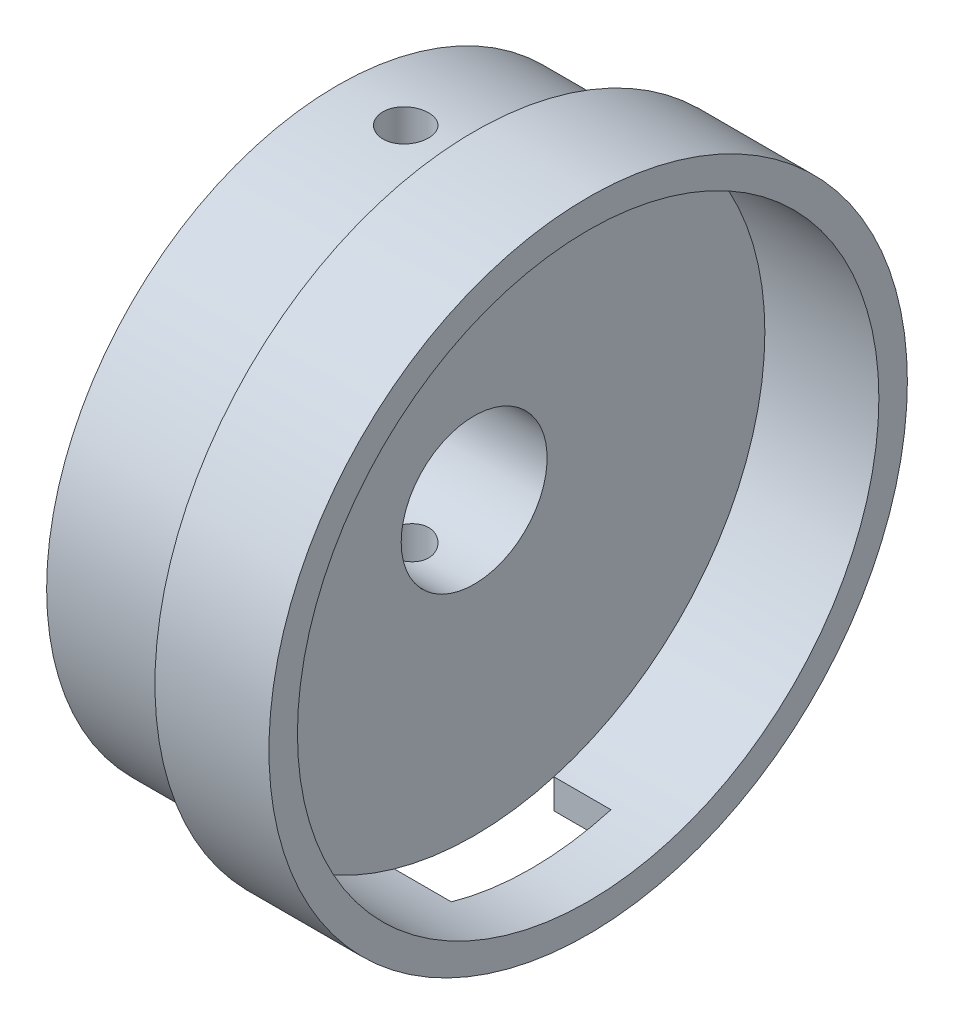
ISO-10303-21;
HEADER;
FILE_DESCRIPTION(('STEP AP214'),'2;1');
FILE_NAME('part.step','',(''),(''),'','','');
FILE_SCHEMA(('AUTOMOTIVE_DESIGN { 1 0 10303 214 1 1 1 1 }'));
ENDSEC;
DATA;
#1=APPLICATION_CONTEXT('core data for automotive mechanical design processes');
#2=APPLICATION_PROTOCOL_DEFINITION('international standard','automotive_design',2000,#1);
#3=PRODUCT_CONTEXT('',#1,'mechanical');
#4=PRODUCT('Part','Part','',(#3));
#5=PRODUCT_RELATED_PRODUCT_CATEGORY('part','',(#4));
#6=PRODUCT_DEFINITION_FORMATION('','',#4);
#7=PRODUCT_DEFINITION_CONTEXT('part definition',#1,'design');
#8=PRODUCT_DEFINITION('design','',#6,#7);
#9=PRODUCT_DEFINITION_SHAPE('','',#8);
#10=(LENGTH_UNIT() NAMED_UNIT(*) SI_UNIT(.MILLI.,.METRE.));
#11=(NAMED_UNIT(*) PLANE_ANGLE_UNIT() SI_UNIT($,.RADIAN.));
#12=(NAMED_UNIT(*) SI_UNIT($,.STERADIAN.) SOLID_ANGLE_UNIT());
#13=UNCERTAINTY_MEASURE_WITH_UNIT(LENGTH_MEASURE(1.E-05),#10,'distance_accuracy_value','');
#14=(GEOMETRIC_REPRESENTATION_CONTEXT(3) GLOBAL_UNCERTAINTY_ASSIGNED_CONTEXT((#13)) GLOBAL_UNIT_ASSIGNED_CONTEXT((#10,
#11,#12)) REPRESENTATION_CONTEXT('',''));
#15=CARTESIAN_POINT('',(0.,0.,0.));
#16=DIRECTION('',(0.,0.,1.));
#17=DIRECTION('',(1.,0.,0.));
#18=AXIS2_PLACEMENT_3D('',#15,#16,#17);
#19=CARTESIAN_POINT('',(6.,0.,0.));
#20=DIRECTION('',(-1.,0.,0.));
#21=DIRECTION('',(0.,0.,1.));
#22=AXIS2_PLACEMENT_3D('',#19,#20,#21);
#23=CYLINDRICAL_SURFACE('',#22,12.75);
#24=CARTESIAN_POINT('',(3.,-12.7107238188862,1.));
#25=CARTESIAN_POINT('',(2.94392232232207,-12.7107243406113,0.999997545402997));
#26=CARTESIAN_POINT('',(2.88780618341134,-12.711098921578,0.995267076426431));
#27=CARTESIAN_POINT('',(2.77712574140391,-12.7125568074061,0.976465511087359));
#28=CARTESIAN_POINT('',(2.72256328335643,-12.7136409210018,0.962383755741015));
#29=CARTESIAN_POINT('',(2.61660929830477,-12.7163943301847,0.925288653760039));
#30=CARTESIAN_POINT('',(2.56521602438958,-12.718063299936,0.902280279573718));
#31=CARTESIAN_POINT('',(2.46703350745583,-12.7217979609019,0.847993707915265));
#32=CARTESIAN_POINT('',(2.42024326497816,-12.7238635657059,0.816717311146294));
#33=CARTESIAN_POINT('',(2.33247534573659,-12.7281640714423,0.746704944077508));
#34=CARTESIAN_POINT('',(2.2915096498998,-12.7303993072281,0.707953973655698));
#35=CARTESIAN_POINT('',(2.21665653635731,-12.7347841425398,0.624124054158458));
#36=CARTESIAN_POINT('',(2.18276942419433,-12.736933738366,0.579044832068279));
#37=CARTESIAN_POINT('',(2.12299615019229,-12.7409082086844,0.483767341341656));
#38=CARTESIAN_POINT('',(2.09712026471766,-12.7427326648433,0.433562606787841));
#39=CARTESIAN_POINT('',(2.05416970584272,-12.7458476952644,0.329504380476724));
#40=CARTESIAN_POINT('',(2.03709489403979,-12.747138277922,0.275650946112666));
#41=CARTESIAN_POINT('',(2.01226541450545,-12.7490378120676,0.165942540916012));
#42=CARTESIAN_POINT('',(2.00449148127114,-12.7496481723632,0.110091955077326));
#43=CARTESIAN_POINT('',(1.99842489139892,-12.7501232582708,-0.00212443471230447));
#44=CARTESIAN_POINT('',(2.00013207654042,-12.7499879963258,-0.0584902300497793));
#45=CARTESIAN_POINT('',(2.01296347370499,-12.7489882436735,-0.170006427252905));
#46=CARTESIAN_POINT('',(2.02406696745649,-12.7481253573473,-0.225159229408966));
#47=CARTESIAN_POINT('',(2.05534359572843,-12.745769280099,-0.332815873257527));
#48=CARTESIAN_POINT('',(2.07551680814398,-12.7442760837637,-0.38531969219497));
#49=CARTESIAN_POINT('',(2.12438341808861,-12.7408246459017,-0.486254061625724));
#50=CARTESIAN_POINT('',(2.15308612321126,-12.7388658968223,-0.534680087859944));
#51=CARTESIAN_POINT('',(2.21819019397672,-12.7347035593126,-0.626034849173092));
#52=CARTESIAN_POINT('',(2.25459169765977,-12.7324999664926,-0.6689634856611));
#53=CARTESIAN_POINT('',(2.33417689364711,-12.7280886774864,-0.748225963049407));
#54=CARTESIAN_POINT('',(2.37737858350749,-12.7258809862274,-0.784541735826188));
#55=CARTESIAN_POINT('',(2.46927500756309,-12.7217163058945,-0.849408098474019));
#56=CARTESIAN_POINT('',(2.51796974557232,-12.7197593169947,-0.877958682953383));
#57=CARTESIAN_POINT('',(2.6194823749345,-12.7163172052411,-0.926483379180942));
#58=CARTESIAN_POINT('',(2.67230069422166,-12.7148321314427,-0.946456599391364));
#59=CARTESIAN_POINT('',(2.78055532226589,-12.7125028949324,-0.977246460155808));
#60=CARTESIAN_POINT('',(2.83599158232287,-12.7116587203034,-0.988063270970628));
#61=CARTESIAN_POINT('',(2.94775048682875,-12.7107087435387,-1.00021048522529));
#62=CARTESIAN_POINT('',(3.00407037900687,-12.7106009819117,-1.00156606387868));
#63=CARTESIAN_POINT('',(3.11613663909585,-12.7111308578479,-0.994818235999364));
#64=CARTESIAN_POINT('',(3.17188301173298,-12.7117684892634,-0.986714907478841));
#65=CARTESIAN_POINT('',(3.28114780781388,-12.713715516424,-0.961300257086736));
#66=CARTESIAN_POINT('',(3.33466897111362,-12.7150240579116,-0.944000643647751));
#67=CARTESIAN_POINT('',(3.43804887258968,-12.7181647486445,-0.900696386768301));
#68=CARTESIAN_POINT('',(3.48790755860196,-12.7199969053458,-0.874691619371105));
#69=CARTESIAN_POINT('',(3.58266251935815,-12.7239831344881,-0.814651365968914));
#70=CARTESIAN_POINT('',(3.62754812013035,-12.7261378768791,-0.780599079547204));
#71=CARTESIAN_POINT('',(3.71097498573334,-12.7305242002115,-0.705454719974119));
#72=CARTESIAN_POINT('',(3.74951615371418,-12.7327557823252,-0.664362539375877));
#73=CARTESIAN_POINT('',(3.8192458107727,-12.7370501470376,-0.576196170875936));
#74=CARTESIAN_POINT('',(3.85041796002178,-12.7391125480134,-0.529109038877456));
#75=CARTESIAN_POINT('',(3.90441268401924,-12.7428306783261,-0.430354045736059));
#76=CARTESIAN_POINT('',(3.92723533397699,-12.7444864113262,-0.378686225859589));
#77=CARTESIAN_POINT('',(3.9638550514017,-12.7472028785278,-0.272295462417285));
#78=CARTESIAN_POINT('',(3.97766228474964,-12.7482642827077,-0.217576035742713));
#79=CARTESIAN_POINT('',(3.99589246922727,-12.7496752098695,-0.106586937249481));
#80=CARTESIAN_POINT('',(4.00031557569272,-12.750024744635,-0.0503172911072756));
#81=CARTESIAN_POINT('',(3.99965022793239,-12.7499725733032,0.0620137305025271));
#82=CARTESIAN_POINT('',(3.99458726549804,-12.7495728805939,0.11807525966329));
#83=CARTESIAN_POINT('',(3.97514657956729,-12.7480711560722,0.228549291694919));
#84=CARTESIAN_POINT('',(3.96076884229205,-12.7469691232208,0.282961792126344));
#85=CARTESIAN_POINT('',(3.92311304779474,-12.7441864209204,0.388595371636288));
#86=CARTESIAN_POINT('',(3.89983536618896,-12.7425057758916,0.439816585294884));
#87=CARTESIAN_POINT('',(3.84504347578554,-12.7387540472532,0.537627953709343));
#88=CARTESIAN_POINT('',(3.81352941883443,-12.7366829708417,0.584218193820389));
#89=CARTESIAN_POINT('',(3.74306381830334,-12.7323763466028,0.671575386050892));
#90=CARTESIAN_POINT('',(3.70409347763409,-12.7301403920703,0.712327155497726));
#91=CARTESIAN_POINT('',(3.61985406695048,-12.7257594565525,0.786726845913246));
#92=CARTESIAN_POINT('',(3.5745834698097,-12.7236144977888,0.82037303956043));
#93=CARTESIAN_POINT('',(3.47895032374241,-12.7196544245251,0.879646536623913));
#94=CARTESIAN_POINT('',(3.42857922240978,-12.7178398787974,0.905260066346803));
#95=CARTESIAN_POINT('',(3.32427207854467,-12.7147530893878,0.94763359783564));
#96=CARTESIAN_POINT('',(3.27034023622888,-12.7134802195002,0.96440382831488));
#97=CARTESIAN_POINT('',(3.18007254792011,-12.7119498929408,0.984320593323631));
#98=CARTESIAN_POINT('',(3.14431806890482,-12.7114922132497,0.99019261077096));
#99=CARTESIAN_POINT('',(3.07238106793165,-12.7108790081857,0.998033101791468));
#100=CARTESIAN_POINT('',(3.03619854697133,-12.7107234821088,1.00000158446014));
#101=CARTESIAN_POINT('',(3.,-12.7107238188862,1.));
#102=B_SPLINE_CURVE_WITH_KNOTS('',3,(#24,#25,#26,#27,#28,#29,#30,#31,#32,#33,#34,#35,#36,#37,
#38,#39,#40,#41,#42,#43,#44,#45,#46,#47,#48,#49,#50,#51,#52,#53,#54,#55,#56,#57,#58,#59,#60,#61,
#62,#63,#64,#65,#66,#67,#68,#69,#70,#71,#72,#73,#74,#75,#76,#77,#78,#79,#80,#81,#82,#83,#84,#85,
#86,#87,#88,#89,#90,#91,#92,#93,#94,#95,#96,#97,#98,#99,#100,#101),.UNSPECIFIED.,.T.,.F.,(4,2,2,
2,2,2,2,2,2,2,2,2,2,2,2,2,2,2,2,2,2,2,2,2,2,2,2,2,2,2,2,2,2,2,2,2,2,2,4),(0.,0.168100870826905,
0.336393679635962,0.504592877572134,0.672755473327883,0.841259119796969,1.00977003812079,
1.17849622594289,1.34721976035509,1.51559319851048,1.68396382686409,1.85196417293701,
2.01996596190571,2.18815175602457,2.35634056598756,2.52498223473981,2.69362402058657,
2.86228333094888,3.03093950507095,3.1991467334922,3.36735257463708,3.53534477228793,
3.70333936215948,3.87168781354754,4.04003883459429,4.20875972198815,4.37747908956576,
4.54600787729903,4.71453387534787,4.88260764507332,5.05068166342162,5.21874858909935,
5.38681241649895,5.55530564779693,5.72383979172791,5.8926613625276,6.06128723302562,
6.16979781511516,6.27830814436769),.UNSPECIFIED.);
#103=CARTESIAN_POINT('',(3.,-12.7107238188862,1.));
#104=VERTEX_POINT('',#103);
#105=EDGE_CURVE('E55',#104,#104,#102,.T.);
#106=ORIENTED_EDGE('',*,*,#105,.F.);
#107=EDGE_LOOP('',(#106));
#108=FACE_BOUND('',#107,.T.);
#109=CARTESIAN_POINT('',(6.,0.,0.));
#110=DIRECTION('',(1.,0.,0.));
#111=DIRECTION('',(0.,0.,-1.));
#112=AXIS2_PLACEMENT_3D('',#109,#110,#111);
#113=CIRCLE('',#112,12.75);
#114=CARTESIAN_POINT('',(6.,0.,-12.75));
#115=VERTEX_POINT('',#114);
#116=EDGE_CURVE('E47',#115,#115,#113,.T.);
#117=ORIENTED_EDGE('',*,*,#116,.F.);
#118=EDGE_LOOP('',(#117));
#119=FACE_BOUND('',#118,.T.);
#120=CARTESIAN_POINT('',(0.,0.,0.));
#121=DIRECTION('',(1.,0.,0.));
#122=DIRECTION('',(0.,0.,-1.));
#123=AXIS2_PLACEMENT_3D('',#120,#121,#122);
#124=CIRCLE('',#123,12.75);
#125=CARTESIAN_POINT('',(0.,0.,-12.75));
#126=VERTEX_POINT('',#125);
#127=EDGE_CURVE('E95',#126,#126,#124,.T.);
#128=ORIENTED_EDGE('',*,*,#127,.T.);
#129=EDGE_LOOP('',(#128));
#130=FACE_BOUND('',#129,.T.);
#131=CARTESIAN_POINT('',(3.,12.7107238188862,-1.));
#132=CARTESIAN_POINT('',(3.05607767767793,12.7107243406113,-0.999997545402997));
#133=CARTESIAN_POINT('',(3.11219381658866,12.711098921578,-0.995267076426431));
#134=CARTESIAN_POINT('',(3.22287425859609,12.7125568074061,-0.976465511087359));
#135=CARTESIAN_POINT('',(3.27743671664357,12.7136409210018,-0.962383755741015));
#136=CARTESIAN_POINT('',(3.38339070169523,12.7163943301847,-0.925288653760039));
#137=CARTESIAN_POINT('',(3.43478397561042,12.718063299936,-0.902280279573718));
#138=CARTESIAN_POINT('',(3.53296649254417,12.7217979609019,-0.847993707915265));
#139=CARTESIAN_POINT('',(3.57975673502184,12.7238635657059,-0.816717311146294));
#140=CARTESIAN_POINT('',(3.66752465426341,12.7281640714423,-0.746704944077508));
#141=CARTESIAN_POINT('',(3.7084903501002,12.7303993072281,-0.707953973655698));
#142=CARTESIAN_POINT('',(3.78334346364269,12.7347841425398,-0.624124054158458));
#143=CARTESIAN_POINT('',(3.81723057580567,12.736933738366,-0.579044832068279));
#144=CARTESIAN_POINT('',(3.87700384980771,12.7409082086844,-0.483767341341656));
#145=CARTESIAN_POINT('',(3.90287973528234,12.7427326648433,-0.433562606787841));
#146=CARTESIAN_POINT('',(3.94583029415728,12.7458476952644,-0.329504380476724));
#147=CARTESIAN_POINT('',(3.96290510596021,12.747138277922,-0.275650946112667));
#148=CARTESIAN_POINT('',(3.98773458549455,12.7490378120676,-0.165942540916012));
#149=CARTESIAN_POINT('',(3.99550851872886,12.7496481723632,-0.110091955077327));
#150=CARTESIAN_POINT('',(4.00157510860109,12.7501232582708,0.00212443471230432));
#151=CARTESIAN_POINT('',(3.99986792345958,12.7499879963258,0.0584902300497793));
#152=CARTESIAN_POINT('',(3.98703652629501,12.7489882436735,0.170006427252906));
#153=CARTESIAN_POINT('',(3.97593303254351,12.7481253573473,0.225159229408966));
#154=CARTESIAN_POINT('',(3.94465640427157,12.745769280099,0.332815873257527));
#155=CARTESIAN_POINT('',(3.92448319185602,12.7442760837637,0.38531969219497));
#156=CARTESIAN_POINT('',(3.87561658191139,12.7408246459017,0.486254061625725));
#157=CARTESIAN_POINT('',(3.84691387678874,12.7388658968223,0.534680087859944));
#158=CARTESIAN_POINT('',(3.78180980602328,12.7347035593126,0.626034849173092));
#159=CARTESIAN_POINT('',(3.74540830234022,12.7324999664926,0.668963485661101));
#160=CARTESIAN_POINT('',(3.66582310635289,12.7280886774864,0.748225963049408));
#161=CARTESIAN_POINT('',(3.62262141649251,12.7258809862274,0.784541735826188));
#162=CARTESIAN_POINT('',(3.53072499243691,12.7217163058945,0.849408098474019));
#163=CARTESIAN_POINT('',(3.48203025442768,12.7197593169947,0.877958682953383));
#164=CARTESIAN_POINT('',(3.3805176250655,12.7163172052411,0.926483379180942));
#165=CARTESIAN_POINT('',(3.32769930577834,12.7148321314427,0.946456599391365));
#166=CARTESIAN_POINT('',(3.2194446777341,12.7125028949324,0.977246460155808));
#167=CARTESIAN_POINT('',(3.16400841767713,12.7116587203034,0.988063270970628));
#168=CARTESIAN_POINT('',(3.05224951317125,12.7107087435387,1.00021048522529));
#169=CARTESIAN_POINT('',(2.99592962099313,12.7106009819117,1.00156606387868));
#170=CARTESIAN_POINT('',(2.88386336090415,12.7111308578479,0.994818235999364));
#171=CARTESIAN_POINT('',(2.82811698826702,12.7117684892634,0.986714907478841));
#172=CARTESIAN_POINT('',(2.71885219218612,12.713715516424,0.961300257086736));
#173=CARTESIAN_POINT('',(2.66533102888638,12.7150240579116,0.944000643647751));
#174=CARTESIAN_POINT('',(2.56195112741032,12.7181647486445,0.900696386768301));
#175=CARTESIAN_POINT('',(2.51209244139804,12.7199969053458,0.874691619371105));
#176=CARTESIAN_POINT('',(2.41733748064185,12.7239831344881,0.814651365968914));
#177=CARTESIAN_POINT('',(2.37245187986965,12.7261378768791,0.780599079547204));
#178=CARTESIAN_POINT('',(2.28902501426666,12.7305242002115,0.705454719974119));
#179=CARTESIAN_POINT('',(2.25048384628582,12.7327557823252,0.664362539375877));
#180=CARTESIAN_POINT('',(2.1807541892273,12.7370501470376,0.576196170875936));
#181=CARTESIAN_POINT('',(2.14958203997822,12.7391125480134,0.529109038877455));
#182=CARTESIAN_POINT('',(2.09558731598076,12.7428306783261,0.430354045736059));
#183=CARTESIAN_POINT('',(2.07276466602301,12.7444864113262,0.378686225859588));
#184=CARTESIAN_POINT('',(2.0361449485983,12.7472028785278,0.272295462417285));
#185=CARTESIAN_POINT('',(2.02233771525036,12.7482642827077,0.217576035742713));
#186=CARTESIAN_POINT('',(2.00410753077273,12.7496752098695,0.106586937249482));
#187=CARTESIAN_POINT('',(1.99968442430728,12.750024744635,0.0503172911072757));
#188=CARTESIAN_POINT('',(2.00034977206762,12.7499725733032,-0.062013730502527));
#189=CARTESIAN_POINT('',(2.00541273450196,12.7495728805939,-0.118075259663289));
#190=CARTESIAN_POINT('',(2.02485342043271,12.7480711560722,-0.228549291694919));
#191=CARTESIAN_POINT('',(2.03923115770795,12.7469691232208,-0.282961792126344));
#192=CARTESIAN_POINT('',(2.07688695220526,12.7441864209204,-0.388595371636288));
#193=CARTESIAN_POINT('',(2.10016463381103,12.7425057758916,-0.439816585294883));
#194=CARTESIAN_POINT('',(2.15495652421446,12.7387540472532,-0.537627953709343));
#195=CARTESIAN_POINT('',(2.18647058116557,12.7366829708417,-0.584218193820389));
#196=CARTESIAN_POINT('',(2.25693618169666,12.7323763466028,-0.671575386050892));
#197=CARTESIAN_POINT('',(2.29590652236591,12.7301403920703,-0.712327155497727));
#198=CARTESIAN_POINT('',(2.38014593304952,12.7257594565525,-0.786726845913247));
#199=CARTESIAN_POINT('',(2.4254165301903,12.7236144977888,-0.82037303956043));
#200=CARTESIAN_POINT('',(2.52104967625759,12.7196544245251,-0.879646536623913));
#201=CARTESIAN_POINT('',(2.57142077759022,12.7178398787974,-0.905260066346803));
#202=CARTESIAN_POINT('',(2.67572792145533,12.7147530893878,-0.94763359783564));
#203=CARTESIAN_POINT('',(2.72965976377112,12.7134802195002,-0.96440382831488));
#204=CARTESIAN_POINT('',(2.81992745207989,12.7119498929408,-0.984320593323631));
#205=CARTESIAN_POINT('',(2.85568193109518,12.7114922132497,-0.99019261077096));
#206=CARTESIAN_POINT('',(2.92761893206835,12.7108790081857,-0.998033101791468));
#207=CARTESIAN_POINT('',(2.96380145302867,12.7107234821088,-1.00000158446014));
#208=CARTESIAN_POINT('',(3.,12.7107238188862,-1.));
#209=B_SPLINE_CURVE_WITH_KNOTS('',3,(#131,#132,#133,#134,#135,#136,#137,#138,#139,#140,#141,
#142,#143,#144,#145,#146,#147,#148,#149,#150,#151,#152,#153,#154,#155,#156,#157,#158,#159,#160,
#161,#162,#163,#164,#165,#166,#167,#168,#169,#170,#171,#172,#173,#174,#175,#176,#177,#178,#179,
#180,#181,#182,#183,#184,#185,#186,#187,#188,#189,#190,#191,#192,#193,#194,#195,#196,#197,#198,
#199,#200,#201,#202,#203,#204,#205,#206,#207,#208),.UNSPECIFIED.,.T.,.F.,(4,2,2,2,2,2,2,2,2,2,2,
2,2,2,2,2,2,2,2,2,2,2,2,2,2,2,2,2,2,2,2,2,2,2,2,2,2,2,4),(0.,0.168100870826905,
0.336393679635962,0.504592877572134,0.672755473327883,0.841259119796969,1.00977003812079,
1.17849622594289,1.34721976035509,1.51559319851047,1.68396382686409,1.85196417293701,
2.01996596190571,2.18815175602457,2.35634056598756,2.52498223473981,2.69362402058657,
2.86228333094888,3.03093950507095,3.1991467334922,3.36735257463708,3.53534477228793,
3.70333936215948,3.87168781354753,4.04003883459429,4.20875972198815,4.37747908956576,
4.54600787729903,4.71453387534787,4.88260764507332,5.05068166342162,5.21874858909935,
5.38681241649895,5.55530564779693,5.72383979172791,5.8926613625276,6.06128723302562,
6.16979781511516,6.27830814436768),.UNSPECIFIED.);
#210=CARTESIAN_POINT('',(3.,12.7107238188862,-1.));
#211=VERTEX_POINT('',#210);
#212=EDGE_CURVE('E90',#211,#211,#209,.T.);
#213=ORIENTED_EDGE('',*,*,#212,.T.);
#214=EDGE_LOOP('',(#213));
#215=FACE_BOUND('',#214,.T.);
#216=ADVANCED_FACE('F43',(#108,#119,#130,#215),#23,.T.);
#217=CARTESIAN_POINT('',(6.,0.,0.));
#218=DIRECTION('',(-1.,0.,0.));
#219=DIRECTION('',(0.,0.,1.));
#220=AXIS2_PLACEMENT_3D('',#217,#218,#219);
#221=CYLINDRICAL_SURFACE('',#220,3.2);
#222=CARTESIAN_POINT('',(3.,-3.03973683071413,1.));
#223=CARTESIAN_POINT('',(3.05467762887039,-3.0397371679444,0.99999963024345));
#224=CARTESIAN_POINT('',(3.10935901491222,-3.0412282529855,0.995500310344962));
#225=CARTESIAN_POINT('',(3.21711532865582,-3.04700511293903,0.977673403223082));
#226=CARTESIAN_POINT('',(3.27018981817649,-3.05129164307935,0.964343430262027));
#227=CARTESIAN_POINT('',(3.37315592156193,-3.06212751043461,0.929358305784155));
#228=CARTESIAN_POINT('',(3.42305298648892,-3.06867284148665,0.907717885892257));
#229=CARTESIAN_POINT('',(3.51852215668683,-3.0832832498174,0.856775313386412));
#230=CARTESIAN_POINT('',(3.56409349596691,-3.09134859550518,0.827471807245369));
#231=CARTESIAN_POINT('',(3.65118309399602,-3.10840102132993,0.760956856497509));
#232=CARTESIAN_POINT('',(3.69253088754912,-3.11740898707314,0.723527519776231));
#233=CARTESIAN_POINT('',(3.76847681056702,-3.13515396688779,0.642289637164482));
#234=CARTESIAN_POINT('',(3.80307399755579,-3.1438909429824,0.598480202014875));
#235=CARTESIAN_POINT('',(3.86528885040909,-3.16034842711921,0.504500729994665));
#236=CARTESIAN_POINT('',(3.89273096306519,-3.16804147650186,0.454209245216069));
#237=CARTESIAN_POINT('',(3.93870083988441,-3.18130041466453,0.349443386282728));
#238=CARTESIAN_POINT('',(3.95723069931966,-3.18686680335945,0.294969998789642));
#239=CARTESIAN_POINT('',(3.98428090247766,-3.1950974065668,0.185171485572876));
#240=CARTESIAN_POINT('',(3.99309259983028,-3.19784591187312,0.129924572374571));
#241=CARTESIAN_POINT('',(4.00137947715002,-3.20042876700814,0.0186726511876165));
#242=CARTESIAN_POINT('',(4.00085677948706,-3.20026377928052,-0.0373321815784666));
#243=CARTESIAN_POINT('',(3.99068136673124,-3.1970969290603,-0.146459584283788));
#244=CARTESIAN_POINT('',(3.98134449318958,-3.19419320777728,-0.199614907451235));
#245=CARTESIAN_POINT('',(3.9543240079656,-3.18599586048681,-0.303562450678216));
#246=CARTESIAN_POINT('',(3.93663985193076,-3.18070207861698,-0.354354516384956));
#247=CARTESIAN_POINT('',(3.89322384874009,-3.16818767783636,-0.452862482523825));
#248=CARTESIAN_POINT('',(3.86739615314957,-3.16094426893602,-0.500533124498265));
#249=CARTESIAN_POINT('',(3.80850312023636,-3.14529378362813,-0.590962008921622));
#250=CARTESIAN_POINT('',(3.77543595268975,-3.13688641315531,-0.633719004967068));
#251=CARTESIAN_POINT('',(3.70138109215895,-3.11938936587859,-0.714990158763106));
#252=CARTESIAN_POINT('',(3.66012074492698,-3.11028585591808,-0.753253239275349));
#253=CARTESIAN_POINT('',(3.57168391854049,-3.09272492351789,-0.822391794076293));
#254=CARTESIAN_POINT('',(3.52450674354023,-3.08426757725855,-0.853266398202702));
#255=CARTESIAN_POINT('',(3.42486602491189,-3.06888677321224,-0.907043720158153));
#256=CARTESIAN_POINT('',(3.37234927276522,-3.06198152291129,-0.929853445621562));
#257=CARTESIAN_POINT('',(3.26395240648459,-3.05070036263463,-0.966226767588001));
#258=CARTESIAN_POINT('',(3.20807350863485,-3.04632354398012,-0.979793686125952));
#259=CARTESIAN_POINT('',(3.09694403795316,-3.04079650741015,-0.996811881484679));
#260=CARTESIAN_POINT('',(3.04175840302105,-3.03952373212419,-1.00064763482981));
#261=CARTESIAN_POINT('',(2.93152820680351,-3.04000862071333,-0.999173955986523));
#262=CARTESIAN_POINT('',(2.87648362503608,-3.04176581633218,-0.993865936890527));
#263=CARTESIAN_POINT('',(2.76975336267355,-3.0479916596061,-0.974598988104683));
#264=CARTESIAN_POINT('',(2.71801658073943,-3.05238043274495,-0.960894649284177));
#265=CARTESIAN_POINT('',(2.61758256640454,-3.0632902987222,-0.925522989288344));
#266=CARTESIAN_POINT('',(2.56888583126342,-3.06981173931781,-0.903854369369271));
#267=CARTESIAN_POINT('',(2.47436871218222,-3.084484317206,-0.852460085246963));
#268=CARTESIAN_POINT('',(2.42867086752568,-3.0926768279127,-0.822521179908449));
#269=CARTESIAN_POINT('',(2.34280772291057,-3.10968279178779,-0.755685126943858));
#270=CARTESIAN_POINT('',(2.30264386485976,-3.11849640588703,-0.718786171752629));
#271=CARTESIAN_POINT('',(2.22727170726972,-3.13619350049997,-0.637258358202881));
#272=CARTESIAN_POINT('',(2.1923377710881,-3.14506473828504,-0.592372519830816));
#273=CARTESIAN_POINT('',(2.130487165343,-3.16151247874982,-0.497161236521118));
#274=CARTESIAN_POINT('',(2.10357012855117,-3.16908904072767,-0.446836040886898));
#275=CARTESIAN_POINT('',(2.05877555002265,-3.18205049542799,-0.342484418665465));
#276=CARTESIAN_POINT('',(2.04083256972505,-3.18745119648957,-0.288488147427004));
#277=CARTESIAN_POINT('',(2.01434196912824,-3.19552194118864,-0.178045803245111));
#278=CARTESIAN_POINT('',(2.0057914087332,-3.19819283931423,-0.121600502672285));
#279=CARTESIAN_POINT('',(1.9985671986003,-3.20044642723569,-0.0103879493191188));
#280=CARTESIAN_POINT('',(1.99949723986339,-3.20015303525912,0.0443513535572179));
#281=CARTESIAN_POINT('',(2.01024944883896,-3.19680782464839,0.152858577538598));
#282=CARTESIAN_POINT('',(2.02007103679356,-3.19375618586094,0.206626561743655));
#283=CARTESIAN_POINT('',(2.04807520737782,-3.18527656675837,0.311004094784633));
#284=CARTESIAN_POINT('',(2.0661516862763,-3.17987878368167,0.361644734759585));
#285=CARTESIAN_POINT('',(2.11005666176678,-3.16726356470358,0.459198740400072));
#286=CARTESIAN_POINT('',(2.13588648797875,-3.16004581673077,0.506111465019584));
#287=CARTESIAN_POINT('',(2.19557820667555,-3.1442391750671,0.596609355975751));
#288=CARTESIAN_POINT('',(2.22968281797116,-3.13561207800806,0.640027685642493));
#289=CARTESIAN_POINT('',(2.30452791155478,-3.11806989237613,0.72065663311945));
#290=CARTESIAN_POINT('',(2.34527037931156,-3.10915471827727,0.757865386803311));
#291=CARTESIAN_POINT('',(2.43385257587283,-3.09169514062089,0.826262927290037));
#292=CARTESIAN_POINT('',(2.48188272249307,-3.08317280691291,0.857211423957753));
#293=CARTESIAN_POINT('',(2.5827184962155,-3.06784100223099,0.910563765988107));
#294=CARTESIAN_POINT('',(2.63552218116091,-3.06103083887145,0.932971067228124));
#295=CARTESIAN_POINT('',(2.73977809385109,-3.05045248354059,0.96696944348656));
#296=CARTESIAN_POINT('',(2.79096203795892,-3.04647452041439,0.979319518703781));
#297=CARTESIAN_POINT('',(2.89476306567952,-3.0411168517948,0.995833966528002));
#298=CARTESIAN_POINT('',(2.94737979296986,-3.03973650617324,1.00000035584327));
#299=CARTESIAN_POINT('',(3.,-3.03973683071413,1.));
#300=B_SPLINE_CURVE_WITH_KNOTS('',3,(#222,#223,#224,#225,#226,#227,#228,#229,#230,#231,#232,
#233,#234,#235,#236,#237,#238,#239,#240,#241,#242,#243,#244,#245,#246,#247,#248,#249,#250,#251,
#252,#253,#254,#255,#256,#257,#258,#259,#260,#261,#262,#263,#264,#265,#266,#267,#268,#269,#270,
#271,#272,#273,#274,#275,#276,#277,#278,#279,#280,#281,#282,#283,#284,#285,#286,#287,#288,#289,
#290,#291,#292,#293,#294,#295,#296,#297,#298,#299),.UNSPECIFIED.,.T.,.F.,(4,2,2,2,2,2,2,2,2,2,2,
2,2,2,2,2,2,2,2,2,2,2,2,2,2,2,2,2,2,2,2,2,2,2,2,2,2,2,4),(0.,0.163838510014586,
0.327721301600959,0.491314915248036,0.654937443893129,0.823656644359877,0.992399383482152,
1.16495857566304,1.33747717929655,1.50466978263744,1.67182437172737,1.83320786371117,
1.99460188147391,2.15797123682044,2.32138194165867,2.49160271145184,2.66184351878338,
2.8339877674288,3.00607011157519,3.17123946622954,3.33638329765181,3.496751776254,
3.65714641792477,3.82214090637598,3.98717830399414,4.15905550239119,4.33092482643579,
4.50152191422708,4.67206558502378,4.8355104194153,4.99894459743755,5.16033477201717,
5.32175263919231,5.48864554474082,5.65558846207662,5.82806236391273,6.00046640632967,
6.15817883487018,6.31585239340933),.UNSPECIFIED.);
#301=CARTESIAN_POINT('',(3.,-3.03973683071413,1.));
#302=VERTEX_POINT('',#301);
#303=EDGE_CURVE('E67',#302,#302,#300,.T.);
#304=ORIENTED_EDGE('',*,*,#303,.F.);
#305=EDGE_LOOP('',(#304));
#306=FACE_BOUND('',#305,.T.);
#307=CARTESIAN_POINT('',(6.,0.,0.));
#308=DIRECTION('',(-1.,0.,0.));
#309=DIRECTION('',(0.,0.,1.));
#310=AXIS2_PLACEMENT_3D('',#307,#308,#309);
#311=CIRCLE('',#310,3.2);
#312=CARTESIAN_POINT('',(6.,0.,3.2));
#313=VERTEX_POINT('',#312);
#314=EDGE_CURVE('E11',#313,#313,#311,.T.);
#315=ORIENTED_EDGE('',*,*,#314,.F.);
#316=EDGE_LOOP('',(#315));
#317=FACE_BOUND('',#316,.T.);
#318=CARTESIAN_POINT('',(0.,0.,0.));
#319=DIRECTION('',(-1.,0.,0.));
#320=DIRECTION('',(0.,0.,1.));
#321=AXIS2_PLACEMENT_3D('',#318,#319,#320);
#322=CIRCLE('',#321,3.2);
#323=CARTESIAN_POINT('',(0.,0.,3.2));
#324=VERTEX_POINT('',#323);
#325=EDGE_CURVE('E58',#324,#324,#322,.T.);
#326=ORIENTED_EDGE('',*,*,#325,.T.);
#327=EDGE_LOOP('',(#326));
#328=FACE_BOUND('',#327,.T.);
#329=CARTESIAN_POINT('',(3.,3.03973683071413,-1.));
#330=CARTESIAN_POINT('',(2.94532237112961,3.0397371679444,-0.99999963024345));
#331=CARTESIAN_POINT('',(2.89064098508778,3.0412282529855,-0.995500310344962));
#332=CARTESIAN_POINT('',(2.78288467134418,3.04700511293903,-0.977673403223082));
#333=CARTESIAN_POINT('',(2.72981018182351,3.05129164307935,-0.964343430262026));
#334=CARTESIAN_POINT('',(2.62684407843808,3.06212751043461,-0.929358305784155));
#335=CARTESIAN_POINT('',(2.57694701351108,3.06867284148665,-0.907717885892257));
#336=CARTESIAN_POINT('',(2.48147784331317,3.0832832498174,-0.856775313386412));
#337=CARTESIAN_POINT('',(2.43590650403309,3.09134859550518,-0.827471807245369));
#338=CARTESIAN_POINT('',(2.34881690600398,3.10840102132993,-0.760956856497509));
#339=CARTESIAN_POINT('',(2.30746911245088,3.11740898707314,-0.723527519776231));
#340=CARTESIAN_POINT('',(2.23152318943298,3.13515396688779,-0.642289637164482));
#341=CARTESIAN_POINT('',(2.19692600244421,3.1438909429824,-0.598480202014875));
#342=CARTESIAN_POINT('',(2.13471114959091,3.16034842711921,-0.504500729994665));
#343=CARTESIAN_POINT('',(2.10726903693481,3.16804147650186,-0.454209245216069));
#344=CARTESIAN_POINT('',(2.06129916011558,3.18130041466453,-0.349443386282729));
#345=CARTESIAN_POINT('',(2.04276930068034,3.18686680335945,-0.294969998789643));
#346=CARTESIAN_POINT('',(2.01571909752234,3.1950974065668,-0.185171485572876));
#347=CARTESIAN_POINT('',(2.00690740016972,3.19784591187312,-0.129924572374571));
#348=CARTESIAN_POINT('',(1.99862052284998,3.20042876700814,-0.0186726511876166));
#349=CARTESIAN_POINT('',(1.99914322051294,3.20026377928052,0.0373321815784666));
#350=CARTESIAN_POINT('',(2.00931863326876,3.1970969290603,0.146459584283788));
#351=CARTESIAN_POINT('',(2.01865550681042,3.19419320777728,0.199614907451235));
#352=CARTESIAN_POINT('',(2.0456759920344,3.18599586048681,0.303562450678216));
#353=CARTESIAN_POINT('',(2.06336014806924,3.18070207861698,0.354354516384956));
#354=CARTESIAN_POINT('',(2.10677615125991,3.16818767783636,0.452862482523825));
#355=CARTESIAN_POINT('',(2.13260384685043,3.16094426893602,0.500533124498265));
#356=CARTESIAN_POINT('',(2.19149687976364,3.14529378362813,0.590962008921622));
#357=CARTESIAN_POINT('',(2.22456404731025,3.13688641315531,0.633719004967068));
#358=CARTESIAN_POINT('',(2.29861890784105,3.11938936587859,0.714990158763106));
#359=CARTESIAN_POINT('',(2.33987925507302,3.11028585591808,0.753253239275349));
#360=CARTESIAN_POINT('',(2.42831608145951,3.09272492351789,0.822391794076293));
#361=CARTESIAN_POINT('',(2.47549325645977,3.08426757725855,0.853266398202702));
#362=CARTESIAN_POINT('',(2.5751339750881,3.06888677321224,0.907043720158152));
#363=CARTESIAN_POINT('',(2.62765072723478,3.06198152291129,0.929853445621562));
#364=CARTESIAN_POINT('',(2.73604759351541,3.05070036263463,0.966226767588));
#365=CARTESIAN_POINT('',(2.79192649136515,3.04632354398012,0.979793686125951));
#366=CARTESIAN_POINT('',(2.90305596204684,3.04079650741015,0.996811881484679));
#367=CARTESIAN_POINT('',(2.95824159697895,3.03952373212419,1.00064763482981));
#368=CARTESIAN_POINT('',(3.06847179319649,3.04000862071333,0.999173955986523));
#369=CARTESIAN_POINT('',(3.12351637496392,3.04176581633218,0.993865936890527));
#370=CARTESIAN_POINT('',(3.23024663732645,3.0479916596061,0.974598988104683));
#371=CARTESIAN_POINT('',(3.28198341926057,3.05238043274495,0.960894649284177));
#372=CARTESIAN_POINT('',(3.38241743359546,3.0632902987222,0.925522989288344));
#373=CARTESIAN_POINT('',(3.43111416873658,3.06981173931781,0.903854369369271));
#374=CARTESIAN_POINT('',(3.52563128781778,3.084484317206,0.852460085246963));
#375=CARTESIAN_POINT('',(3.57132913247432,3.0926768279127,0.822521179908449));
#376=CARTESIAN_POINT('',(3.65719227708943,3.10968279178779,0.755685126943858));
#377=CARTESIAN_POINT('',(3.69735613514024,3.11849640588703,0.718786171752629));
#378=CARTESIAN_POINT('',(3.77272829273028,3.13619350049997,0.63725835820288));
#379=CARTESIAN_POINT('',(3.8076622289119,3.14506473828504,0.592372519830815));
#380=CARTESIAN_POINT('',(3.869512834657,3.16151247874982,0.497161236521118));
#381=CARTESIAN_POINT('',(3.89642987144883,3.16908904072767,0.446836040886898));
#382=CARTESIAN_POINT('',(3.94122444997735,3.18205049542799,0.342484418665464));
#383=CARTESIAN_POINT('',(3.95916743027495,3.18745119648957,0.288488147427004));
#384=CARTESIAN_POINT('',(3.98565803087177,3.19552194118864,0.178045803245111));
#385=CARTESIAN_POINT('',(3.9942085912668,3.19819283931423,0.121600502672285));
#386=CARTESIAN_POINT('',(4.0014328013997,3.20044642723569,0.0103879493191187));
#387=CARTESIAN_POINT('',(4.00050276013661,3.20015303525912,-0.044351353557218));
#388=CARTESIAN_POINT('',(3.98975055116104,3.19680782464839,-0.152858577538598));
#389=CARTESIAN_POINT('',(3.97992896320644,3.19375618586094,-0.206626561743655));
#390=CARTESIAN_POINT('',(3.95192479262218,3.18527656675837,-0.311004094784633));
#391=CARTESIAN_POINT('',(3.9338483137237,3.17987878368167,-0.361644734759585));
#392=CARTESIAN_POINT('',(3.88994333823322,3.16726356470358,-0.459198740400072));
#393=CARTESIAN_POINT('',(3.86411351202125,3.16004581673077,-0.506111465019584));
#394=CARTESIAN_POINT('',(3.80442179332445,3.1442391750671,-0.596609355975752));
#395=CARTESIAN_POINT('',(3.77031718202884,3.13561207800806,-0.640027685642493));
#396=CARTESIAN_POINT('',(3.69547208844522,3.11806989237613,-0.720656633119451));
#397=CARTESIAN_POINT('',(3.65472962068844,3.10915471827727,-0.757865386803311));
#398=CARTESIAN_POINT('',(3.56614742412717,3.09169514062089,-0.826262927290038));
#399=CARTESIAN_POINT('',(3.51811727750693,3.08317280691291,-0.857211423957753));
#400=CARTESIAN_POINT('',(3.4172815037845,3.06784100223099,-0.910563765988107));
#401=CARTESIAN_POINT('',(3.36447781883909,3.06103083887145,-0.932971067228124));
#402=CARTESIAN_POINT('',(3.26022190614891,3.05045248354059,-0.96696944348656));
#403=CARTESIAN_POINT('',(3.20903796204108,3.04647452041439,-0.979319518703781));
#404=CARTESIAN_POINT('',(3.10523693432048,3.0411168517948,-0.995833966528002));
#405=CARTESIAN_POINT('',(3.05262020703014,3.03973650617324,-1.00000035584327));
#406=CARTESIAN_POINT('',(3.,3.03973683071413,-1.));
#407=B_SPLINE_CURVE_WITH_KNOTS('',3,(#329,#330,#331,#332,#333,#334,#335,#336,#337,#338,#339,
#340,#341,#342,#343,#344,#345,#346,#347,#348,#349,#350,#351,#352,#353,#354,#355,#356,#357,#358,
#359,#360,#361,#362,#363,#364,#365,#366,#367,#368,#369,#370,#371,#372,#373,#374,#375,#376,#377,
#378,#379,#380,#381,#382,#383,#384,#385,#386,#387,#388,#389,#390,#391,#392,#393,#394,#395,#396,
#397,#398,#399,#400,#401,#402,#403,#404,#405,#406),.UNSPECIFIED.,.T.,.F.,(4,2,2,2,2,2,2,2,2,2,2,
2,2,2,2,2,2,2,2,2,2,2,2,2,2,2,2,2,2,2,2,2,2,2,2,2,2,2,4),(0.,0.163838510014586,
0.327721301600959,0.491314915248036,0.654937443893129,0.823656644359877,0.992399383482152,
1.16495857566304,1.33747717929655,1.50466978263744,1.67182437172737,1.83320786371117,
1.99460188147392,2.15797123682044,2.32138194165867,2.49160271145184,2.66184351878338,
2.8339877674288,3.00607011157519,3.17123946622954,3.33638329765181,3.496751776254,
3.65714641792477,3.82214090637598,3.98717830399414,4.15905550239119,4.33092482643579,
4.50152191422708,4.67206558502378,4.8355104194153,4.99894459743755,5.16033477201717,
5.32175263919231,5.48864554474082,5.65558846207662,5.82806236391273,6.00046640632967,
6.15817883487019,6.31585239340933),.UNSPECIFIED.);
#408=CARTESIAN_POINT('',(3.,3.03973683071413,-1.));
#409=VERTEX_POINT('',#408);
#410=EDGE_CURVE('E86',#409,#409,#407,.T.);
#411=ORIENTED_EDGE('',*,*,#410,.T.);
#412=EDGE_LOOP('',(#411));
#413=FACE_BOUND('',#412,.T.);
#414=ADVANCED_FACE('F105',(#306,#317,#328,#413),#221,.F.);
#415=CARTESIAN_POINT('',(0.,0.,0.));
#416=DIRECTION('',(1.,0.,0.));
#417=DIRECTION('',(0.,0.,-1.));
#418=AXIS2_PLACEMENT_3D('',#415,#416,#417);
#419=PLANE('',#418);
#420=ORIENTED_EDGE('',*,*,#325,.F.);
#421=EDGE_LOOP('',(#420));
#422=FACE_BOUND('',#421,.T.);
#423=ORIENTED_EDGE('',*,*,#127,.F.);
#424=EDGE_LOOP('',(#423));
#425=FACE_BOUND('',#424,.T.);
#426=ADVANCED_FACE('F103',(#422,#425),#419,.F.);
#427=CARTESIAN_POINT('',(3.,-12.751,0.));
#428=DIRECTION('',(0.,1.,0.));
#429=DIRECTION('',(0.,0.,1.));
#430=AXIS2_PLACEMENT_3D('',#427,#428,#429);
#431=CYLINDRICAL_SURFACE('',#430,1.);
#432=ORIENTED_EDGE('',*,*,#303,.T.);
#433=EDGE_LOOP('',(#432));
#434=FACE_BOUND('',#433,.T.);
#435=ORIENTED_EDGE('',*,*,#105,.T.);
#436=EDGE_LOOP('',(#435));
#437=FACE_BOUND('',#436,.T.);
#438=ADVANCED_FACE('F73',(#434,#437),#431,.F.);
#439=CARTESIAN_POINT('',(3.,12.751,0.));
#440=DIRECTION('',(0.,-1.,0.));
#441=DIRECTION('',(0.,0.,-1.));
#442=AXIS2_PLACEMENT_3D('',#439,#440,#441);
#443=CYLINDRICAL_SURFACE('',#442,1.);
#444=ORIENTED_EDGE('',*,*,#410,.F.);
#445=EDGE_LOOP('',(#444));
#446=FACE_BOUND('',#445,.T.);
#447=ORIENTED_EDGE('',*,*,#212,.F.);
#448=EDGE_LOOP('',(#447));
#449=FACE_BOUND('',#448,.T.);
#450=ADVANCED_FACE('F79',(#446,#449),#443,.F.);
#451=CARTESIAN_POINT('',(6.,0.,0.));
#452=DIRECTION('',(1.,0.,0.));
#453=DIRECTION('',(0.,0.,-1.));
#454=AXIS2_PLACEMENT_3D('',#451,#452,#453);
#455=PLANE('',#454);
#456=ORIENTED_EDGE('',*,*,#314,.T.);
#457=EDGE_LOOP('',(#456));
#458=FACE_BOUND('',#457,.T.);
#459=ORIENTED_EDGE('',*,*,#116,.T.);
#460=EDGE_LOOP('',(#459));
#461=FACE_BOUND('',#460,.T.);
#462=ADVANCED_FACE('F45',(#458,#461),#455,.T.);
#463=CLOSED_SHELL('',(#216,#414,#426,#438,#450,#462));
#464=MANIFOLD_SOLID_BREP('B2',#463);
#465=CARTESIAN_POINT('',(6.,0.,0.));
#466=DIRECTION('',(1.,0.,0.));
#467=DIRECTION('',(0.,0.,-1.));
#468=AXIS2_PLACEMENT_3D('',#465,#466,#467);
#469=PLANE('',#468);
#470=CARTESIAN_POINT('',(6.,0.,0.));
#471=DIRECTION('',(1.,0.,0.));
#472=DIRECTION('',(0.,0.,-1.));
#473=AXIS2_PLACEMENT_3D('',#470,#471,#472);
#474=CIRCLE('',#473,14.);
#475=CARTESIAN_POINT('',(6.,-13.555441711726,-3.5));
#476=VERTEX_POINT('',#475);
#477=CARTESIAN_POINT('',(6.,-13.555441711726,3.5));
#478=VERTEX_POINT('',#477);
#479=EDGE_CURVE('E217',#476,#478,#474,.T.);
#480=ORIENTED_EDGE('',*,*,#479,.F.);
#481=DIRECTION('',(0.,1.,0.));
#482=VECTOR('',#481,1.);
#483=CARTESIAN_POINT('',(6.,-16.,-3.5));
#484=LINE('',#483,#482);
#485=CARTESIAN_POINT('',(6.,-12.2601998352392,-3.5));
#486=VERTEX_POINT('',#485);
#487=EDGE_CURVE('E212',#476,#486,#484,.T.);
#488=ORIENTED_EDGE('',*,*,#487,.T.);
#489=CARTESIAN_POINT('',(6.,0.,0.));
#490=DIRECTION('',(1.,0.,0.));
#491=DIRECTION('',(0.,0.,-1.));
#492=AXIS2_PLACEMENT_3D('',#489,#490,#491);
#493=CIRCLE('',#492,12.75);
#494=CARTESIAN_POINT('',(6.,-12.2601998352392,3.5));
#495=VERTEX_POINT('',#494);
#496=EDGE_CURVE('E219',#486,#495,#493,.T.);
#497=ORIENTED_EDGE('',*,*,#496,.T.);
#498=DIRECTION('',(0.,1.,0.));
#499=VECTOR('',#498,1.);
#500=CARTESIAN_POINT('',(6.,-16.,3.5));
#501=LINE('',#500,#499);
#502=EDGE_CURVE('E180',#478,#495,#501,.T.);
#503=ORIENTED_EDGE('',*,*,#502,.F.);
#504=EDGE_LOOP('',(#480,#488,#497,#503));
#505=FACE_BOUND('',#504,.T.);
#506=ADVANCED_FACE('F165',(#505),#469,.F.);
#507=CARTESIAN_POINT('',(11.,0.,0.));
#508=DIRECTION('',(-1.,0.,0.));
#509=DIRECTION('',(0.,0.,1.));
#510=AXIS2_PLACEMENT_3D('',#507,#508,#509);
#511=CYLINDRICAL_SURFACE('',#510,14.);
#512=CARTESIAN_POINT('',(11.,0.,0.));
#513=DIRECTION('',(1.,0.,0.));
#514=DIRECTION('',(0.,0.,-1.));
#515=AXIS2_PLACEMENT_3D('',#512,#513,#514);
#516=CIRCLE('',#515,14.);
#517=CARTESIAN_POINT('',(11.,0.,-14.));
#518=VERTEX_POINT('',#517);
#519=EDGE_CURVE('E223',#518,#518,#516,.T.);
#520=ORIENTED_EDGE('',*,*,#519,.F.);
#521=EDGE_LOOP('',(#520));
#522=FACE_BOUND('',#521,.T.);
#523=CARTESIAN_POINT('',(8.5,0.,0.));
#524=DIRECTION('',(1.,0.,0.));
#525=DIRECTION('',(0.,0.,-1.));
#526=AXIS2_PLACEMENT_3D('',#523,#524,#525);
#527=CIRCLE('',#526,14.);
#528=CARTESIAN_POINT('',(8.5,-13.555441711726,3.5));
#529=VERTEX_POINT('',#528);
#530=CARTESIAN_POINT('',(8.5,-13.555441711726,-3.5));
#531=VERTEX_POINT('',#530);
#532=EDGE_CURVE('E211',#529,#531,#527,.T.);
#533=ORIENTED_EDGE('',*,*,#532,.T.);
#534=DIRECTION('',(-1.,0.,0.));
#535=VECTOR('',#534,1.);
#536=CARTESIAN_POINT('',(11.,-13.555441711726,-3.5));
#537=LINE('',#536,#535);
#538=EDGE_CURVE('E222',#531,#476,#537,.T.);
#539=ORIENTED_EDGE('',*,*,#538,.T.);
#540=ORIENTED_EDGE('',*,*,#479,.T.);
#541=DIRECTION('',(-1.,0.,0.));
#542=VECTOR('',#541,1.);
#543=CARTESIAN_POINT('',(11.,-13.555441711726,3.5));
#544=LINE('',#543,#542);
#545=EDGE_CURVE('E204',#478,#529,#544,.F.);
#546=ORIENTED_EDGE('',*,*,#545,.T.);
#547=EDGE_LOOP('',(#533,#539,#540,#546));
#548=FACE_BOUND('',#547,.T.);
#549=ADVANCED_FACE('F167',(#522,#548),#511,.T.);
#550=CARTESIAN_POINT('',(11.,0.,0.));
#551=DIRECTION('',(1.,0.,0.));
#552=DIRECTION('',(0.,0.,-1.));
#553=AXIS2_PLACEMENT_3D('',#550,#551,#552);
#554=PLANE('',#553);
#555=CARTESIAN_POINT('',(11.,0.,0.));
#556=DIRECTION('',(1.,0.,0.));
#557=DIRECTION('',(0.,0.,-1.));
#558=AXIS2_PLACEMENT_3D('',#555,#556,#557);
#559=CIRCLE('',#558,12.75);
#560=CARTESIAN_POINT('',(11.,0.,-12.75));
#561=VERTEX_POINT('',#560);
#562=EDGE_CURVE('E228',#561,#561,#559,.T.);
#563=ORIENTED_EDGE('',*,*,#562,.F.);
#564=EDGE_LOOP('',(#563));
#565=FACE_BOUND('',#564,.T.);
#566=ORIENTED_EDGE('',*,*,#519,.T.);
#567=EDGE_LOOP('',(#566));
#568=FACE_BOUND('',#567,.T.);
#569=ADVANCED_FACE('F249',(#565,#568),#554,.T.);
#570=CARTESIAN_POINT('',(6.,0.,0.));
#571=DIRECTION('',(1.,0.,0.));
#572=DIRECTION('',(0.,0.,-1.));
#573=AXIS2_PLACEMENT_3D('',#570,#571,#572);
#574=CYLINDRICAL_SURFACE('',#573,12.75);
#575=ORIENTED_EDGE('',*,*,#496,.F.);
#576=DIRECTION('',(1.,0.,0.));
#577=VECTOR('',#576,1.);
#578=CARTESIAN_POINT('',(6.,-12.2601998352392,-3.5));
#579=LINE('',#578,#577);
#580=CARTESIAN_POINT('',(8.5,-12.2601998352392,-3.5));
#581=VERTEX_POINT('',#580);
#582=EDGE_CURVE('E41',#486,#581,#579,.T.);
#583=ORIENTED_EDGE('',*,*,#582,.T.);
#584=CARTESIAN_POINT('',(8.5,0.,0.));
#585=DIRECTION('',(1.,0.,0.));
#586=DIRECTION('',(0.,0.,-1.));
#587=AXIS2_PLACEMENT_3D('',#584,#585,#586);
#588=CIRCLE('',#587,12.75);
#589=CARTESIAN_POINT('',(8.5,-12.2601998352392,3.5));
#590=VERTEX_POINT('',#589);
#591=EDGE_CURVE('E173',#581,#590,#588,.F.);
#592=ORIENTED_EDGE('',*,*,#591,.T.);
#593=DIRECTION('',(1.,0.,0.));
#594=VECTOR('',#593,1.);
#595=CARTESIAN_POINT('',(6.,-12.2601998352392,3.5));
#596=LINE('',#595,#594);
#597=EDGE_CURVE('E226',#590,#495,#596,.F.);
#598=ORIENTED_EDGE('',*,*,#597,.T.);
#599=EDGE_LOOP('',(#575,#583,#592,#598));
#600=FACE_BOUND('',#599,.T.);
#601=ORIENTED_EDGE('',*,*,#562,.T.);
#602=EDGE_LOOP('',(#601));
#603=FACE_BOUND('',#602,.T.);
#604=ADVANCED_FACE('F234',(#600,#603),#574,.F.);
#605=CARTESIAN_POINT('',(6.,-16.,-3.5));
#606=DIRECTION('',(0.,0.,-1.));
#607=DIRECTION('',(-1.,0.,0.));
#608=AXIS2_PLACEMENT_3D('',#605,#606,#607);
#609=PLANE('',#608);
#610=DIRECTION('',(0.,1.,0.));
#611=VECTOR('',#610,1.);
#612=CARTESIAN_POINT('',(8.5,-16.,-3.5));
#613=LINE('',#612,#611);
#614=EDGE_CURVE('E239',#531,#581,#613,.T.);
#615=ORIENTED_EDGE('',*,*,#614,.T.);
#616=ORIENTED_EDGE('',*,*,#582,.F.);
#617=ORIENTED_EDGE('',*,*,#487,.F.);
#618=ORIENTED_EDGE('',*,*,#538,.F.);
#619=EDGE_LOOP('',(#615,#616,#617,#618));
#620=FACE_BOUND('',#619,.T.);
#621=ADVANCED_FACE('F240',(#620),#609,.F.);
#622=CARTESIAN_POINT('',(8.5,-16.,-3.5));
#623=DIRECTION('',(1.,0.,0.));
#624=DIRECTION('',(0.,0.,-1.));
#625=AXIS2_PLACEMENT_3D('',#622,#623,#624);
#626=PLANE('',#625);
#627=DIRECTION('',(0.,1.,0.));
#628=VECTOR('',#627,1.);
#629=CARTESIAN_POINT('',(8.5,-16.,3.5));
#630=LINE('',#629,#628);
#631=EDGE_CURVE('E207',#529,#590,#630,.T.);
#632=ORIENTED_EDGE('',*,*,#631,.T.);
#633=ORIENTED_EDGE('',*,*,#591,.F.);
#634=ORIENTED_EDGE('',*,*,#614,.F.);
#635=ORIENTED_EDGE('',*,*,#532,.F.);
#636=EDGE_LOOP('',(#632,#633,#634,#635));
#637=FACE_BOUND('',#636,.T.);
#638=ADVANCED_FACE('F238',(#637),#626,.F.);
#639=CARTESIAN_POINT('',(6.,-16.,3.5));
#640=DIRECTION('',(0.,0.,1.));
#641=DIRECTION('',(1.,0.,0.));
#642=AXIS2_PLACEMENT_3D('',#639,#640,#641);
#643=PLANE('',#642);
#644=ORIENTED_EDGE('',*,*,#502,.T.);
#645=ORIENTED_EDGE('',*,*,#597,.F.);
#646=ORIENTED_EDGE('',*,*,#631,.F.);
#647=ORIENTED_EDGE('',*,*,#545,.F.);
#648=EDGE_LOOP('',(#644,#645,#646,#647));
#649=FACE_BOUND('',#648,.T.);
#650=ADVANCED_FACE('F205',(#649),#643,.F.);
#651=CLOSED_SHELL('',(#506,#549,#569,#604,#621,#638,#650));
#652=MANIFOLD_SOLID_BREP('B6',#651);
#653=ADVANCED_BREP_SHAPE_REPRESENTATION('',(#18,#464,#652),#14);
#654=SHAPE_DEFINITION_REPRESENTATION(#9,#653);
ENDSEC;
END-ISO-10303-21;
